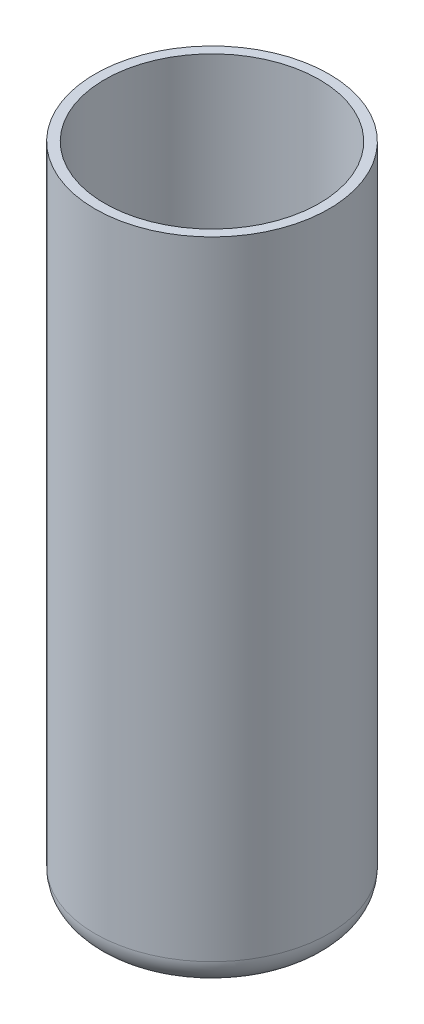
ISO-10303-21;
HEADER;
FILE_DESCRIPTION(('STEP AP214'),'2;1');
FILE_NAME('part.step','',(''),(''),'','','');
FILE_SCHEMA(('AUTOMOTIVE_DESIGN { 1 0 10303 214 1 1 1 1 }'));
ENDSEC;
DATA;
#1=APPLICATION_CONTEXT('core data for automotive mechanical design processes');
#2=APPLICATION_PROTOCOL_DEFINITION('international standard','automotive_design',2000,#1);
#3=PRODUCT_CONTEXT('',#1,'mechanical');
#4=PRODUCT('Part','Part','',(#3));
#5=PRODUCT_RELATED_PRODUCT_CATEGORY('part','',(#4));
#6=PRODUCT_DEFINITION_FORMATION('','',#4);
#7=PRODUCT_DEFINITION_CONTEXT('part definition',#1,'design');
#8=PRODUCT_DEFINITION('design','',#6,#7);
#9=PRODUCT_DEFINITION_SHAPE('','',#8);
#10=(LENGTH_UNIT() NAMED_UNIT(*) SI_UNIT(.MILLI.,.METRE.));
#11=(NAMED_UNIT(*) PLANE_ANGLE_UNIT() SI_UNIT($,.RADIAN.));
#12=(NAMED_UNIT(*) SI_UNIT($,.STERADIAN.) SOLID_ANGLE_UNIT());
#13=UNCERTAINTY_MEASURE_WITH_UNIT(LENGTH_MEASURE(1.E-05),#10,'distance_accuracy_value','');
#14=(GEOMETRIC_REPRESENTATION_CONTEXT(3) GLOBAL_UNCERTAINTY_ASSIGNED_CONTEXT((#13)) GLOBAL_UNIT_ASSIGNED_CONTEXT((#10,
#11,#12)) REPRESENTATION_CONTEXT('',''));
#15=CARTESIAN_POINT('',(0.,0.,0.));
#16=DIRECTION('',(0.,0.,1.));
#17=DIRECTION('',(1.,0.,0.));
#18=AXIS2_PLACEMENT_3D('',#15,#16,#17);
#19=CARTESIAN_POINT('',(20.,3.63680362110586,0.));
#20=DIRECTION('',(0.,1.,0.));
#21=DIRECTION('',(0.,0.,1.));
#22=AXIS2_PLACEMENT_3D('',#19,#20,#21);
#23=PLANE('',#22);
#24=CARTESIAN_POINT('',(0.,3.63680362110586,0.));
#25=DIRECTION('',(0.,-1.,0.));
#26=DIRECTION('',(0.,0.,-1.));
#27=AXIS2_PLACEMENT_3D('',#24,#25,#26);
#28=CIRCLE('',#27,20.);
#29=CARTESIAN_POINT('',(0.,3.63680362110586,-20.));
#30=VERTEX_POINT('',#29);
#31=EDGE_CURVE('E10',#30,#30,#28,.T.);
#32=ORIENTED_EDGE('',*,*,#31,.F.);
#33=EDGE_LOOP('',(#32));
#34=FACE_BOUND('',#33,.T.);
#35=ADVANCED_FACE('F31',(#34),#23,.T.);
#36=CARTESIAN_POINT('',(0.,18.2132846854274,0.));
#37=DIRECTION('',(0.,-1.,0.));
#38=DIRECTION('',(0.,0.,-1.));
#39=AXIS2_PLACEMENT_3D('',#36,#37,#38);
#40=TOROIDAL_SURFACE('',#39,18.0068687031896,14.7121165229497);
#41=ORIENTED_EDGE('',*,*,#31,.T.);
#42=EDGE_LOOP('',(#41));
#43=FACE_BOUND('',#42,.T.);
#44=CARTESIAN_POINT('',(0.,7.,0.));
#45=DIRECTION('',(0.,-1.,0.));
#46=DIRECTION('',(0.,0.,-1.));
#47=AXIS2_PLACEMENT_3D('',#44,#45,#46);
#48=CIRCLE('',#47,27.5309759657318);
#49=CARTESIAN_POINT('',(0.,7.,-27.5309759657318));
#50=VERTEX_POINT('',#49);
#51=EDGE_CURVE('E37',#50,#50,#48,.T.);
#52=ORIENTED_EDGE('',*,*,#51,.F.);
#53=EDGE_LOOP('',(#52));
#54=FACE_BOUND('',#53,.T.);
#55=ADVANCED_FACE('F73',(#43,#54),#40,.F.);
#56=CARTESIAN_POINT('',(0.,0.,0.));
#57=DIRECTION('',(0.,-1.,0.));
#58=DIRECTION('',(0.,0.,-1.));
#59=AXIS2_PLACEMENT_3D('',#56,#57,#58);
#60=CYLINDRICAL_SURFACE('',#59,27.5309759657318);
#61=ORIENTED_EDGE('',*,*,#51,.T.);
#62=EDGE_LOOP('',(#61));
#63=FACE_BOUND('',#62,.T.);
#64=CARTESIAN_POINT('',(0.,168.,0.));
#65=DIRECTION('',(0.,-1.,0.));
#66=DIRECTION('',(0.,0.,-1.));
#67=AXIS2_PLACEMENT_3D('',#64,#65,#66);
#68=CIRCLE('',#67,27.5309759657318);
#69=CARTESIAN_POINT('',(0.,168.,-27.5309759657318));
#70=VERTEX_POINT('',#69);
#71=EDGE_CURVE('E41',#70,#70,#68,.T.);
#72=ORIENTED_EDGE('',*,*,#71,.F.);
#73=EDGE_LOOP('',(#72));
#74=FACE_BOUND('',#73,.T.);
#75=ADVANCED_FACE('F78',(#63,#74),#60,.F.);
#76=CARTESIAN_POINT('',(27.5309759657318,168.,0.));
#77=DIRECTION('',(0.,1.,0.));
#78=DIRECTION('',(0.,0.,1.));
#79=AXIS2_PLACEMENT_3D('',#76,#77,#78);
#80=PLANE('',#79);
#81=ORIENTED_EDGE('',*,*,#71,.T.);
#82=EDGE_LOOP('',(#81));
#83=FACE_BOUND('',#82,.T.);
#84=CARTESIAN_POINT('',(0.,168.,0.));
#85=DIRECTION('',(0.,-1.,0.));
#86=DIRECTION('',(0.,0.,-1.));
#87=AXIS2_PLACEMENT_3D('',#84,#85,#86);
#88=CIRCLE('',#87,30.);
#89=CARTESIAN_POINT('',(0.,168.,-30.));
#90=VERTEX_POINT('',#89);
#91=EDGE_CURVE('E45',#90,#90,#88,.T.);
#92=ORIENTED_EDGE('',*,*,#91,.F.);
#93=EDGE_LOOP('',(#92));
#94=FACE_BOUND('',#93,.T.);
#95=ADVANCED_FACE('F69',(#83,#94),#80,.T.);
#96=CARTESIAN_POINT('',(0.,0.,0.));
#97=DIRECTION('',(0.,-1.,0.));
#98=DIRECTION('',(0.,0.,-1.));
#99=AXIS2_PLACEMENT_3D('',#96,#97,#98);
#100=CYLINDRICAL_SURFACE('',#99,30.);
#101=ORIENTED_EDGE('',*,*,#91,.T.);
#102=EDGE_LOOP('',(#101));
#103=FACE_BOUND('',#102,.T.);
#104=CARTESIAN_POINT('',(0.,7.,0.));
#105=DIRECTION('',(0.,-1.,0.));
#106=DIRECTION('',(0.,0.,-1.));
#107=AXIS2_PLACEMENT_3D('',#104,#105,#106);
#108=CIRCLE('',#107,30.);
#109=CARTESIAN_POINT('',(0.,7.,-30.));
#110=VERTEX_POINT('',#109);
#111=EDGE_CURVE('E50',#110,#110,#108,.T.);
#112=ORIENTED_EDGE('',*,*,#111,.F.);
#113=EDGE_LOOP('',(#112));
#114=FACE_BOUND('',#113,.T.);
#115=ADVANCED_FACE('F61',(#103,#114),#100,.T.);
#116=CARTESIAN_POINT('',(0.,7.,0.));
#117=DIRECTION('',(0.,-1.,0.));
#118=DIRECTION('',(0.,0.,-1.));
#119=AXIS2_PLACEMENT_3D('',#116,#117,#118);
#120=TOROIDAL_SURFACE('',#119,23.,7.);
#121=ORIENTED_EDGE('',*,*,#111,.T.);
#122=EDGE_LOOP('',(#121));
#123=FACE_BOUND('',#122,.T.);
#124=CARTESIAN_POINT('',(0.,0.,0.));
#125=DIRECTION('',(0.,-1.,0.));
#126=DIRECTION('',(0.,0.,-1.));
#127=AXIS2_PLACEMENT_3D('',#124,#125,#126);
#128=CIRCLE('',#127,23.);
#129=CARTESIAN_POINT('',(0.,0.,-23.));
#130=VERTEX_POINT('',#129);
#131=EDGE_CURVE('E53',#130,#130,#128,.T.);
#132=ORIENTED_EDGE('',*,*,#131,.F.);
#133=EDGE_LOOP('',(#132));
#134=FACE_BOUND('',#133,.T.);
#135=ADVANCED_FACE('F59',(#123,#134),#120,.T.);
#136=CARTESIAN_POINT('',(0.,0.,0.));
#137=DIRECTION('',(0.,-1.,0.));
#138=DIRECTION('',(0.,0.,-1.));
#139=AXIS2_PLACEMENT_3D('',#136,#137,#138);
#140=PLANE('',#139);
#141=ORIENTED_EDGE('',*,*,#131,.T.);
#142=EDGE_LOOP('',(#141));
#143=FACE_BOUND('',#142,.T.);
#144=ADVANCED_FACE('F57',(#143),#140,.T.);
#145=CLOSED_SHELL('',(#35,#55,#75,#95,#115,#135,#144));
#146=MANIFOLD_SOLID_BREP('B2',#145);
#147=ADVANCED_BREP_SHAPE_REPRESENTATION('',(#18,#146),#14);
#148=SHAPE_DEFINITION_REPRESENTATION(#9,#147);
ENDSEC;
END-ISO-10303-21;
